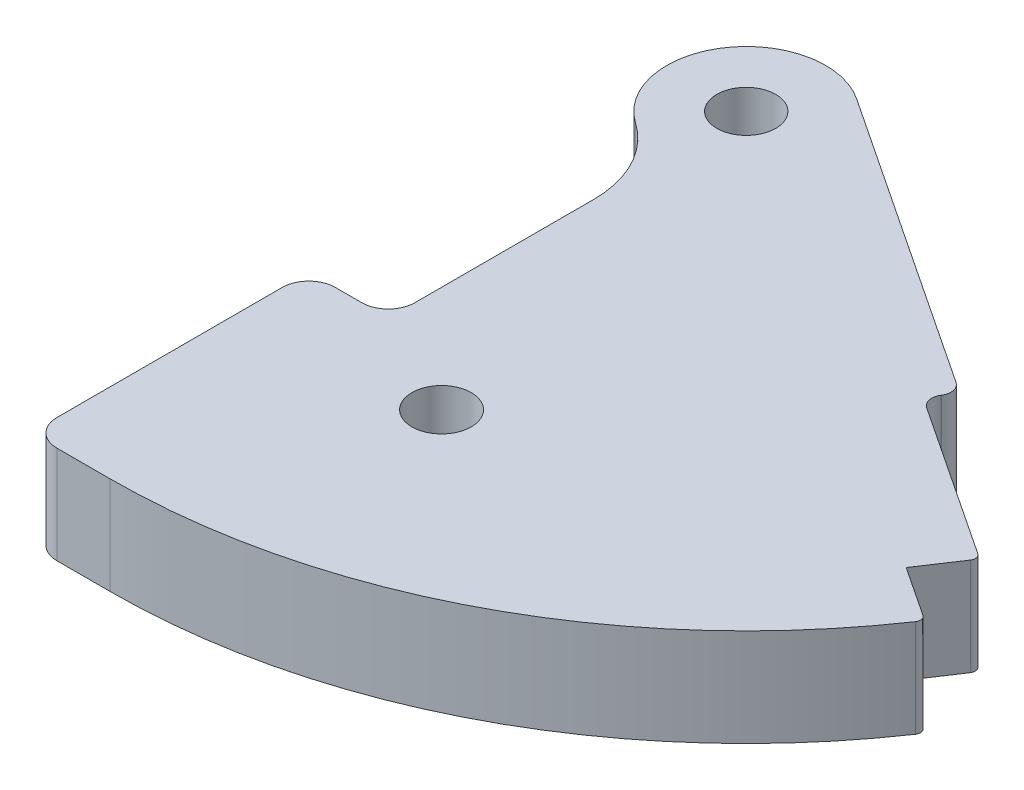
ISO-10303-21;
HEADER;
FILE_DESCRIPTION(('STEP AP214'),'2;1');
FILE_NAME('part.step','',(''),(''),'','','');
FILE_SCHEMA(('AUTOMOTIVE_DESIGN { 1 0 10303 214 1 1 1 1 }'));
ENDSEC;
DATA;
#1=APPLICATION_CONTEXT('core data for automotive mechanical design processes');
#2=APPLICATION_PROTOCOL_DEFINITION('international standard','automotive_design',2000,#1);
#3=PRODUCT_CONTEXT('',#1,'mechanical');
#4=PRODUCT('Part','Part','',(#3));
#5=PRODUCT_RELATED_PRODUCT_CATEGORY('part','',(#4));
#6=PRODUCT_DEFINITION_FORMATION('','',#4);
#7=PRODUCT_DEFINITION_CONTEXT('part definition',#1,'design');
#8=PRODUCT_DEFINITION('design','',#6,#7);
#9=PRODUCT_DEFINITION_SHAPE('','',#8);
#10=(LENGTH_UNIT() NAMED_UNIT(*) SI_UNIT(.MILLI.,.METRE.));
#11=(NAMED_UNIT(*) PLANE_ANGLE_UNIT() SI_UNIT($,.RADIAN.));
#12=(NAMED_UNIT(*) SI_UNIT($,.STERADIAN.) SOLID_ANGLE_UNIT());
#13=UNCERTAINTY_MEASURE_WITH_UNIT(LENGTH_MEASURE(1.E-05),#10,'distance_accuracy_value','');
#14=(GEOMETRIC_REPRESENTATION_CONTEXT(3) GLOBAL_UNCERTAINTY_ASSIGNED_CONTEXT((#13)) GLOBAL_UNIT_ASSIGNED_CONTEXT((#10,
#11,#12)) REPRESENTATION_CONTEXT('',''));
#15=CARTESIAN_POINT('',(0.,0.,0.));
#16=DIRECTION('',(0.,0.,1.));
#17=DIRECTION('',(1.,0.,0.));
#18=AXIS2_PLACEMENT_3D('',#15,#16,#17);
#19=CARTESIAN_POINT('',(2.6325709273446,5.842,-3.96875));
#20=DIRECTION('',(0.552770798392566,0.,-0.833333333333333));
#21=DIRECTION('',(-0.833333333333333,0.,-0.552770798392566));
#22=AXIS2_PLACEMENT_3D('',#19,#20,#21);
#23=PLANE('',#22);
#24=DIRECTION('',(0.833333333333334,0.,0.552770798392567));
#25=VECTOR('',#24,1.);
#26=CARTESIAN_POINT('',(2.6325709273446,5.842,-3.96875));
#27=LINE('',#26,#25);
#28=CARTESIAN_POINT('',(2.6325709273446,5.842,-3.96875));
#29=VERTEX_POINT('',#28);
#30=CARTESIAN_POINT('',(20.3349867986522,5.842,7.77370426559191));
#31=VERTEX_POINT('',#30);
#32=EDGE_CURVE('E180',#29,#31,#27,.T.);
#33=ORIENTED_EDGE('',*,*,#32,.T.);
#34=DIRECTION('',(0.,-1.,0.));
#35=VECTOR('',#34,1.);
#36=CARTESIAN_POINT('',(20.3349867986522,5.842,7.7737042655919));
#37=LINE('',#36,#35);
#38=CARTESIAN_POINT('',(20.3349867986522,0.,7.77370426559191));
#39=VERTEX_POINT('',#38);
#40=EDGE_CURVE('E317',#31,#39,#37,.T.);
#41=ORIENTED_EDGE('',*,*,#40,.T.);
#42=DIRECTION('',(0.833333333333334,0.,0.552770798392567));
#43=VECTOR('',#42,1.);
#44=CARTESIAN_POINT('',(2.6325709273446,0.,-3.96875));
#45=LINE('',#44,#43);
#46=CARTESIAN_POINT('',(2.6325709273446,0.,-3.96875));
#47=VERTEX_POINT('',#46);
#48=EDGE_CURVE('E187',#47,#39,#45,.T.);
#49=ORIENTED_EDGE('',*,*,#48,.F.);
#50=DIRECTION('',(0.,-1.,0.));
#51=VECTOR('',#50,1.);
#52=CARTESIAN_POINT('',(2.6325709273446,5.842,-3.96875));
#53=LINE('',#52,#51);
#54=EDGE_CURVE('E173',#29,#47,#53,.T.);
#55=ORIENTED_EDGE('',*,*,#54,.F.);
#56=EDGE_LOOP('',(#33,#41,#49,#55));
#57=FACE_BOUND('',#56,.T.);
#58=ADVANCED_FACE('F37',(#57),#23,.T.);
#59=CARTESIAN_POINT('',(0.,5.842,0.));
#60=DIRECTION('',(0.,-1.,0.));
#61=DIRECTION('',(0.,0.,-1.));
#62=AXIS2_PLACEMENT_3D('',#59,#60,#61);
#63=CYLINDRICAL_SURFACE('',#62,4.7625);
#64=CARTESIAN_POINT('',(0.,0.,0.));
#65=DIRECTION('',(0.,1.,0.));
#66=DIRECTION('',(0.,0.,1.));
#67=AXIS2_PLACEMENT_3D('',#64,#65,#66);
#68=CIRCLE('',#67,4.7625);
#69=CARTESIAN_POINT('',(-2.72142857142857,0.,3.90835422916248));
#70=VERTEX_POINT('',#69);
#71=EDGE_CURVE('E232',#70,#47,#68,.F.);
#72=ORIENTED_EDGE('',*,*,#71,.F.);
#73=DIRECTION('',(0.,-1.,0.));
#74=VECTOR('',#73,1.);
#75=CARTESIAN_POINT('',(-2.72142857142857,5.842,3.90835422916248));
#76=LINE('',#75,#74);
#77=CARTESIAN_POINT('',(-2.72142857142857,5.842,3.90835422916248));
#78=VERTEX_POINT('',#77);
#79=EDGE_CURVE('E176',#70,#78,#76,.F.);
#80=ORIENTED_EDGE('',*,*,#79,.T.);
#81=CARTESIAN_POINT('',(0.,5.842,0.));
#82=DIRECTION('',(0.,1.,0.));
#83=DIRECTION('',(0.,0.,1.));
#84=AXIS2_PLACEMENT_3D('',#81,#82,#83);
#85=CIRCLE('',#84,4.7625);
#86=EDGE_CURVE('E169',#78,#29,#85,.F.);
#87=ORIENTED_EDGE('',*,*,#86,.T.);
#88=ORIENTED_EDGE('',*,*,#54,.T.);
#89=EDGE_LOOP('',(#72,#80,#87,#88));
#90=FACE_BOUND('',#89,.T.);
#91=ADVANCED_FACE('F172',(#90),#63,.T.);
#92=CARTESIAN_POINT('',(0.,5.842,0.));
#93=DIRECTION('',(1.,0.,0.));
#94=DIRECTION('',(0.,0.,-1.));
#95=AXIS2_PLACEMENT_3D('',#92,#93,#94);
#96=PLANE('',#95);
#97=DIRECTION('',(0.,0.,1.));
#98=VECTOR('',#97,1.);
#99=CARTESIAN_POINT('',(0.,5.842,0.));
#100=LINE('',#99,#98);
#101=CARTESIAN_POINT('',(0.,5.842,9.11949320137912));
#102=VERTEX_POINT('',#101);
#103=CARTESIAN_POINT('',(0.,5.842,19.84375));
#104=VERTEX_POINT('',#103);
#105=EDGE_CURVE('E179',#102,#104,#100,.T.);
#106=ORIENTED_EDGE('',*,*,#105,.F.);
#107=DIRECTION('',(0.,-1.,0.));
#108=VECTOR('',#107,1.);
#109=CARTESIAN_POINT('',(0.,5.842,9.11949320137912));
#110=LINE('',#109,#108);
#111=CARTESIAN_POINT('',(0.,0.,9.11949320137912));
#112=VERTEX_POINT('',#111);
#113=EDGE_CURVE('E291',#102,#112,#110,.T.);
#114=ORIENTED_EDGE('',*,*,#113,.T.);
#115=DIRECTION('',(0.,0.,1.));
#116=VECTOR('',#115,1.);
#117=CARTESIAN_POINT('',(0.,0.,0.));
#118=LINE('',#117,#116);
#119=CARTESIAN_POINT('',(0.,0.,19.84375));
#120=VERTEX_POINT('',#119);
#121=EDGE_CURVE('E234',#112,#120,#118,.T.);
#122=ORIENTED_EDGE('',*,*,#121,.T.);
#123=DIRECTION('',(0.,-1.,0.));
#124=VECTOR('',#123,1.);
#125=CARTESIAN_POINT('',(0.,5.842,19.84375));
#126=LINE('',#125,#124);
#127=EDGE_CURVE('E283',#120,#104,#126,.F.);
#128=ORIENTED_EDGE('',*,*,#127,.T.);
#129=EDGE_LOOP('',(#106,#114,#122,#128));
#130=FACE_BOUND('',#129,.T.);
#131=ADVANCED_FACE('F347',(#130),#96,.F.);
#132=CARTESIAN_POINT('',(0.,5.842,21.43125));
#133=DIRECTION('',(0.,0.,1.));
#134=DIRECTION('',(1.,0.,0.));
#135=AXIS2_PLACEMENT_3D('',#132,#133,#134);
#136=PLANE('',#135);
#137=DIRECTION('',(-1.,0.,0.));
#138=VECTOR('',#137,1.);
#139=CARTESIAN_POINT('',(0.,0.,21.43125));
#140=LINE('',#139,#138);
#141=CARTESIAN_POINT('',(-1.5875,0.,21.43125));
#142=VERTEX_POINT('',#141);
#143=CARTESIAN_POINT('',(-3.175,0.,21.43125));
#144=VERTEX_POINT('',#143);
#145=EDGE_CURVE('E236',#142,#144,#140,.T.);
#146=ORIENTED_EDGE('',*,*,#145,.T.);
#147=DIRECTION('',(0.,-1.,0.));
#148=VECTOR('',#147,1.);
#149=CARTESIAN_POINT('',(-3.175,5.842,21.43125));
#150=LINE('',#149,#148);
#151=CARTESIAN_POINT('',(-3.175,5.842,21.43125));
#152=VERTEX_POINT('',#151);
#153=EDGE_CURVE('E281',#144,#152,#150,.F.);
#154=ORIENTED_EDGE('',*,*,#153,.T.);
#155=DIRECTION('',(-1.,0.,0.));
#156=VECTOR('',#155,1.);
#157=CARTESIAN_POINT('',(0.,5.842,21.43125));
#158=LINE('',#157,#156);
#159=CARTESIAN_POINT('',(-1.5875,5.842,21.43125));
#160=VERTEX_POINT('',#159);
#161=EDGE_CURVE('E202',#160,#152,#158,.T.);
#162=ORIENTED_EDGE('',*,*,#161,.F.);
#163=DIRECTION('',(0.,-1.,0.));
#164=VECTOR('',#163,1.);
#165=CARTESIAN_POINT('',(-1.5875,0.,21.43125));
#166=LINE('',#165,#164);
#167=EDGE_CURVE('E278',#160,#142,#166,.T.);
#168=ORIENTED_EDGE('',*,*,#167,.T.);
#169=EDGE_LOOP('',(#146,#154,#162,#168));
#170=FACE_BOUND('',#169,.T.);
#171=ADVANCED_FACE('F356',(#170),#136,.F.);
#172=CARTESIAN_POINT('',(-4.7625,5.842,0.));
#173=DIRECTION('',(1.,0.,0.));
#174=DIRECTION('',(0.,0.,-1.));
#175=AXIS2_PLACEMENT_3D('',#172,#173,#174);
#176=PLANE('',#175);
#177=DIRECTION('',(0.,0.,1.));
#178=VECTOR('',#177,1.);
#179=CARTESIAN_POINT('',(-4.7625,0.,0.));
#180=LINE('',#179,#178);
#181=CARTESIAN_POINT('',(-4.7625,0.,23.01875));
#182=VERTEX_POINT('',#181);
#183=CARTESIAN_POINT('',(-4.7625,0.,36.5125));
#184=VERTEX_POINT('',#183);
#185=EDGE_CURVE('E239',#182,#184,#180,.T.);
#186=ORIENTED_EDGE('',*,*,#185,.T.);
#187=DIRECTION('',(0.,-1.,0.));
#188=VECTOR('',#187,1.);
#189=CARTESIAN_POINT('',(-4.7625,5.842,36.5125));
#190=LINE('',#189,#188);
#191=CARTESIAN_POINT('',(-4.7625,5.842,36.5125));
#192=VERTEX_POINT('',#191);
#193=EDGE_CURVE('E272',#184,#192,#190,.F.);
#194=ORIENTED_EDGE('',*,*,#193,.T.);
#195=DIRECTION('',(0.,0.,1.));
#196=VECTOR('',#195,1.);
#197=CARTESIAN_POINT('',(-4.7625,5.842,0.));
#198=LINE('',#197,#196);
#199=CARTESIAN_POINT('',(-4.7625,5.842,23.01875));
#200=VERTEX_POINT('',#199);
#201=EDGE_CURVE('E205',#200,#192,#198,.T.);
#202=ORIENTED_EDGE('',*,*,#201,.F.);
#203=DIRECTION('',(0.,-1.,0.));
#204=VECTOR('',#203,1.);
#205=CARTESIAN_POINT('',(-4.7625,5.842,23.01875));
#206=LINE('',#205,#204);
#207=EDGE_CURVE('E269',#200,#182,#206,.T.);
#208=ORIENTED_EDGE('',*,*,#207,.T.);
#209=EDGE_LOOP('',(#186,#194,#202,#208));
#210=FACE_BOUND('',#209,.T.);
#211=ADVANCED_FACE('F365',(#210),#176,.F.);
#212=CARTESIAN_POINT('',(0.,5.842,38.1));
#213=DIRECTION('',(0.,0.,1.));
#214=DIRECTION('',(1.,0.,0.));
#215=AXIS2_PLACEMENT_3D('',#212,#213,#214);
#216=PLANE('',#215);
#217=DIRECTION('',(-1.,0.,0.));
#218=VECTOR('',#217,1.);
#219=CARTESIAN_POINT('',(0.,5.842,38.1));
#220=LINE('',#219,#218);
#221=CARTESIAN_POINT('',(0.,5.842,38.1));
#222=VERTEX_POINT('',#221);
#223=CARTESIAN_POINT('',(-3.175,5.842,38.1));
#224=VERTEX_POINT('',#223);
#225=EDGE_CURVE('E208',#222,#224,#220,.T.);
#226=ORIENTED_EDGE('',*,*,#225,.T.);
#227=DIRECTION('',(0.,-1.,0.));
#228=VECTOR('',#227,1.);
#229=CARTESIAN_POINT('',(-3.175,0.,38.1));
#230=LINE('',#229,#228);
#231=CARTESIAN_POINT('',(-3.175,0.,38.1));
#232=VERTEX_POINT('',#231);
#233=EDGE_CURVE('E188',#224,#232,#230,.T.);
#234=ORIENTED_EDGE('',*,*,#233,.T.);
#235=DIRECTION('',(-1.,0.,0.));
#236=VECTOR('',#235,1.);
#237=CARTESIAN_POINT('',(0.,0.,38.1));
#238=LINE('',#237,#236);
#239=CARTESIAN_POINT('',(0.,0.,38.1));
#240=VERTEX_POINT('',#239);
#241=EDGE_CURVE('E242',#240,#232,#238,.T.);
#242=ORIENTED_EDGE('',*,*,#241,.F.);
#243=DIRECTION('',(0.,-1.,0.));
#244=VECTOR('',#243,1.);
#245=CARTESIAN_POINT('',(0.,5.842,38.1));
#246=LINE('',#245,#244);
#247=EDGE_CURVE('E189',#222,#240,#246,.T.);
#248=ORIENTED_EDGE('',*,*,#247,.F.);
#249=EDGE_LOOP('',(#226,#234,#242,#248));
#250=FACE_BOUND('',#249,.T.);
#251=ADVANCED_FACE('F373',(#250),#216,.T.);
#252=CARTESIAN_POINT('',(0.,5.842,0.));
#253=DIRECTION('',(0.,-1.,0.));
#254=DIRECTION('',(0.,0.,-1.));
#255=AXIS2_PLACEMENT_3D('',#252,#253,#254);
#256=CYLINDRICAL_SURFACE('',#255,38.1);
#257=CARTESIAN_POINT('',(0.,0.,0.));
#258=DIRECTION('',(0.,1.,0.));
#259=DIRECTION('',(0.,0.,1.));
#260=AXIS2_PLACEMENT_3D('',#257,#258,#259);
#261=CIRCLE('',#260,38.1);
#262=CARTESIAN_POINT('',(31.526550765146,0.,21.393611122311));
#263=VERTEX_POINT('',#262);
#264=EDGE_CURVE('E245',#240,#263,#261,.T.);
#265=ORIENTED_EDGE('',*,*,#264,.T.);
#266=DIRECTION('',(0.,-1.,0.));
#267=VECTOR('',#266,1.);
#268=CARTESIAN_POINT('',(31.5265507651461,5.842,21.393611122311));
#269=LINE('',#268,#267);
#270=CARTESIAN_POINT('',(31.526550765146,5.842,21.393611122311));
#271=VERTEX_POINT('',#270);
#272=EDGE_CURVE('E306',#263,#271,#269,.F.);
#273=ORIENTED_EDGE('',*,*,#272,.T.);
#274=CARTESIAN_POINT('',(0.,5.842,0.));
#275=DIRECTION('',(0.,1.,0.));
#276=DIRECTION('',(0.,0.,1.));
#277=AXIS2_PLACEMENT_3D('',#274,#275,#276);
#278=CIRCLE('',#277,38.1);
#279=EDGE_CURVE('E211',#222,#271,#278,.T.);
#280=ORIENTED_EDGE('',*,*,#279,.F.);
#281=ORIENTED_EDGE('',*,*,#247,.T.);
#282=EDGE_LOOP('',(#265,#273,#280,#281));
#283=FACE_BOUND('',#282,.T.);
#284=ADVANCED_FACE('F378',(#283),#256,.T.);
#285=CARTESIAN_POINT('',(0.,5.842,0.));
#286=DIRECTION('',(0.552770798392565,0.,-0.833333333333334));
#287=DIRECTION('',(-0.833333333333334,0.,-0.552770798392565));
#288=AXIS2_PLACEMENT_3D('',#285,#286,#287);
#289=PLANE('',#288);
#290=DIRECTION('',(0.833333333333334,0.,0.552770798392565));
#291=VECTOR('',#290,1.);
#292=CARTESIAN_POINT('',(0.,5.842,0.));
#293=LINE('',#292,#291);
#294=CARTESIAN_POINT('',(28.4427083333333,5.842,18.8667583126363));
#295=VERTEX_POINT('',#294);
#296=CARTESIAN_POINT('',(31.4175301052878,5.842,20.8400318397869));
#297=VERTEX_POINT('',#296);
#298=EDGE_CURVE('E214',#295,#297,#293,.T.);
#299=ORIENTED_EDGE('',*,*,#298,.T.);
#300=DIRECTION('',(0.,1.,0.));
#301=VECTOR('',#300,1.);
#302=CARTESIAN_POINT('',(31.4175301052878,0.,20.8400318397869));
#303=LINE('',#302,#301);
#304=CARTESIAN_POINT('',(31.4175301052878,0.,20.8400318397869));
#305=VERTEX_POINT('',#304);
#306=EDGE_CURVE('E299',#297,#305,#303,.F.);
#307=ORIENTED_EDGE('',*,*,#306,.T.);
#308=DIRECTION('',(0.833333333333334,0.,0.552770798392565));
#309=VECTOR('',#308,1.);
#310=CARTESIAN_POINT('',(0.,0.,0.));
#311=LINE('',#310,#309);
#312=CARTESIAN_POINT('',(28.4427083333333,0.,18.8667583126363));
#313=VERTEX_POINT('',#312);
#314=EDGE_CURVE('E248',#313,#305,#311,.T.);
#315=ORIENTED_EDGE('',*,*,#314,.F.);
#316=DIRECTION('',(0.,-1.,0.));
#317=VECTOR('',#316,1.);
#318=CARTESIAN_POINT('',(28.4427083333333,5.842,18.8667583126363));
#319=LINE('',#318,#317);
#320=EDGE_CURVE('E227',#295,#313,#319,.T.);
#321=ORIENTED_EDGE('',*,*,#320,.F.);
#322=EDGE_LOOP('',(#299,#307,#315,#321));
#323=FACE_BOUND('',#322,.T.);
#324=ADVANCED_FACE('F387',(#323),#289,.T.);
#325=CARTESIAN_POINT('',(28.4427083333333,5.842,18.8667583126363));
#326=DIRECTION('',(-0.833333333333333,0.,-0.552770798392567));
#327=DIRECTION('',(-0.552770798392567,0.,0.833333333333333));
#328=AXIS2_PLACEMENT_3D('',#325,#326,#327);
#329=PLANE('',#328);
#330=DIRECTION('',(0.552770798392567,0.,-0.833333333333333));
#331=VECTOR('',#330,1.);
#332=CARTESIAN_POINT('',(28.4427083333333,0.,18.8667583126363));
#333=LINE('',#332,#331);
#334=CARTESIAN_POINT('',(29.9783747076177,0.,16.5516541459696));
#335=VERTEX_POINT('',#334);
#336=EDGE_CURVE('E251',#313,#335,#333,.T.);
#337=ORIENTED_EDGE('',*,*,#336,.T.);
#338=DIRECTION('',(0.,-1.,0.));
#339=VECTOR('',#338,1.);
#340=CARTESIAN_POINT('',(29.9783747076177,5.842,16.5516541459696));
#341=LINE('',#340,#339);
#342=CARTESIAN_POINT('',(29.9783747076177,5.842,16.5516541459696));
#343=VERTEX_POINT('',#342);
#344=EDGE_CURVE('E315',#335,#343,#341,.F.);
#345=ORIENTED_EDGE('',*,*,#344,.T.);
#346=DIRECTION('',(0.552770798392567,0.,-0.833333333333333));
#347=VECTOR('',#346,1.);
#348=CARTESIAN_POINT('',(28.4427083333333,5.842,18.8667583126363));
#349=LINE('',#348,#347);
#350=EDGE_CURVE('E217',#295,#343,#349,.T.);
#351=ORIENTED_EDGE('',*,*,#350,.F.);
#352=ORIENTED_EDGE('',*,*,#320,.T.);
#353=EDGE_LOOP('',(#337,#345,#351,#352));
#354=FACE_BOUND('',#353,.T.);
#355=ADVANCED_FACE('F391',(#354),#329,.F.);
#356=CARTESIAN_POINT('',(1.75504728489641,5.842,-2.64583333333335));
#357=DIRECTION('',(-0.552770798392567,0.,0.833333333333333));
#358=DIRECTION('',(0.833333333333333,0.,0.552770798392567));
#359=AXIS2_PLACEMENT_3D('',#356,#357,#358);
#360=PLANE('',#359);
#361=DIRECTION('',(-0.833333333333333,0.,-0.552770798392567));
#362=VECTOR('',#361,1.);
#363=CARTESIAN_POINT('',(1.75504728489641,0.,-2.64583333333335));
#364=LINE('',#363,#362);
#365=CARTESIAN_POINT('',(29.8670264515631,0.,16.0015440686909));
#366=VERTEX_POINT('',#365);
#367=CARTESIAN_POINT('',(20.7805937267347,0.,9.97428646247842));
#368=VERTEX_POINT('',#367);
#369=EDGE_CURVE('E254',#366,#368,#364,.T.);
#370=ORIENTED_EDGE('',*,*,#369,.T.);
#371=DIRECTION('',(0.,-1.,0.));
#372=VECTOR('',#371,1.);
#373=CARTESIAN_POINT('',(20.7805937267347,5.842,9.97428646247842));
#374=LINE('',#373,#372);
#375=CARTESIAN_POINT('',(20.7805937267347,5.842,9.97428646247842));
#376=VERTEX_POINT('',#375);
#377=EDGE_CURVE('E52',#368,#376,#374,.F.);
#378=ORIENTED_EDGE('',*,*,#377,.T.);
#379=DIRECTION('',(-0.833333333333333,0.,-0.552770798392567));
#380=VECTOR('',#379,1.);
#381=CARTESIAN_POINT('',(1.75504728489641,5.842,-2.64583333333335));
#382=LINE('',#381,#380);
#383=CARTESIAN_POINT('',(29.8670264515631,5.842,16.0015440686909));
#384=VERTEX_POINT('',#383);
#385=EDGE_CURVE('E220',#384,#376,#382,.T.);
#386=ORIENTED_EDGE('',*,*,#385,.F.);
#387=DIRECTION('',(0.,-1.,0.));
#388=VECTOR('',#387,1.);
#389=CARTESIAN_POINT('',(29.8670264515631,5.842,16.0015440686909));
#390=LINE('',#389,#388);
#391=EDGE_CURVE('E312',#384,#366,#390,.T.);
#392=ORIENTED_EDGE('',*,*,#391,.T.);
#393=EDGE_LOOP('',(#370,#378,#386,#392));
#394=FACE_BOUND('',#393,.T.);
#395=ADVANCED_FACE('F334',(#394),#360,.F.);
#396=CARTESIAN_POINT('',(18.6372029811088,5.842,11.8855763007916));
#397=DIRECTION('',(0.843137791243833,0.,0.537697559020376));
#398=DIRECTION('',(0.537697559020376,0.,-0.843137791243833));
#399=AXIS2_PLACEMENT_3D('',#396,#397,#398);
#400=PLANE('',#399);
#401=DIRECTION('',(-0.537697559020376,0.,0.843137791243833));
#402=VECTOR('',#401,1.);
#403=CARTESIAN_POINT('',(18.6372029811088,0.,11.8855763007916));
#404=LINE('',#403,#402);
#405=CARTESIAN_POINT('',(20.5654655992279,0.,8.86196003639766));
#406=VERTEX_POINT('',#405);
#407=CARTESIAN_POINT('',(20.550114926159,0.,8.88603069167266));
#408=VERTEX_POINT('',#407);
#409=EDGE_CURVE('E256',#406,#408,#404,.T.);
#410=ORIENTED_EDGE('',*,*,#409,.F.);
#411=DIRECTION('',(0.,-1.,0.));
#412=VECTOR('',#411,1.);
#413=CARTESIAN_POINT('',(20.5654655992279,5.842,8.86196003639766));
#414=LINE('',#413,#412);
#415=CARTESIAN_POINT('',(20.5654655992279,5.842,8.86196003639766));
#416=VERTEX_POINT('',#415);
#417=EDGE_CURVE('E324',#406,#416,#414,.F.);
#418=ORIENTED_EDGE('',*,*,#417,.T.);
#419=DIRECTION('',(-0.537697559020376,0.,0.843137791243833));
#420=VECTOR('',#419,1.);
#421=CARTESIAN_POINT('',(18.6372029811088,5.842,11.8855763007916));
#422=LINE('',#421,#420);
#423=CARTESIAN_POINT('',(20.550114926159,5.842,8.88603069167266));
#424=VERTEX_POINT('',#423);
#425=EDGE_CURVE('E222',#416,#424,#422,.T.);
#426=ORIENTED_EDGE('',*,*,#425,.T.);
#427=DIRECTION('',(0.,-1.,0.));
#428=VECTOR('',#427,1.);
#429=CARTESIAN_POINT('',(20.550114926159,5.842,8.88603069167266));
#430=LINE('',#429,#428);
#431=EDGE_CURVE('E321',#424,#408,#430,.T.);
#432=ORIENTED_EDGE('',*,*,#431,.T.);
#433=EDGE_LOOP('',(#410,#418,#426,#432));
#434=FACE_BOUND('',#433,.T.);
#435=ADVANCED_FACE('F337',(#434),#400,.T.);
#436=CARTESIAN_POINT('',(6.35,5.842,24.5934442484171));
#437=DIRECTION('',(0.,-1.,0.));
#438=DIRECTION('',(0.,0.,-1.));
#439=AXIS2_PLACEMENT_3D('',#436,#437,#438);
#440=CYLINDRICAL_SURFACE('',#439,1.778);
#441=CARTESIAN_POINT('',(6.35,5.842,24.5934442484171));
#442=DIRECTION('',(0.,1.,0.));
#443=DIRECTION('',(0.,0.,1.));
#444=AXIS2_PLACEMENT_3D('',#441,#442,#443);
#445=CIRCLE('',#444,1.778);
#446=CARTESIAN_POINT('',(6.35,5.842,26.3714442484171));
#447=VERTEX_POINT('',#446);
#448=EDGE_CURVE('E195',#447,#447,#445,.T.);
#449=ORIENTED_EDGE('',*,*,#448,.T.);
#450=EDGE_LOOP('',(#449));
#451=FACE_BOUND('',#450,.T.);
#452=CARTESIAN_POINT('',(6.35,0.,24.5934442484171));
#453=DIRECTION('',(0.,1.,0.));
#454=DIRECTION('',(0.,0.,1.));
#455=AXIS2_PLACEMENT_3D('',#452,#453,#454);
#456=CIRCLE('',#455,1.778);
#457=CARTESIAN_POINT('',(6.35,0.,26.3714442484171));
#458=VERTEX_POINT('',#457);
#459=EDGE_CURVE('E228',#458,#458,#456,.T.);
#460=ORIENTED_EDGE('',*,*,#459,.F.);
#461=EDGE_LOOP('',(#460));
#462=FACE_BOUND('',#461,.T.);
#463=ADVANCED_FACE('F411',(#451,#462),#440,.F.);
#464=CARTESIAN_POINT('',(0.,5.842,0.));
#465=DIRECTION('',(0.,-1.,0.));
#466=DIRECTION('',(0.,0.,-1.));
#467=AXIS2_PLACEMENT_3D('',#464,#465,#466);
#468=CYLINDRICAL_SURFACE('',#467,1.7653);
#469=CARTESIAN_POINT('',(0.,5.842,0.));
#470=DIRECTION('',(0.,1.,0.));
#471=DIRECTION('',(0.,0.,1.));
#472=AXIS2_PLACEMENT_3D('',#469,#470,#471);
#473=CIRCLE('',#472,1.7653);
#474=CARTESIAN_POINT('',(0.,5.842,1.7653));
#475=VERTEX_POINT('',#474);
#476=EDGE_CURVE('E224',#475,#475,#473,.T.);
#477=ORIENTED_EDGE('',*,*,#476,.T.);
#478=EDGE_LOOP('',(#477));
#479=FACE_BOUND('',#478,.T.);
#480=CARTESIAN_POINT('',(0.,0.,0.));
#481=DIRECTION('',(0.,1.,0.));
#482=DIRECTION('',(0.,0.,1.));
#483=AXIS2_PLACEMENT_3D('',#480,#481,#482);
#484=CIRCLE('',#483,1.7653);
#485=CARTESIAN_POINT('',(0.,0.,1.7653));
#486=VERTEX_POINT('',#485);
#487=EDGE_CURVE('E198',#486,#486,#484,.T.);
#488=ORIENTED_EDGE('',*,*,#487,.F.);
#489=EDGE_LOOP('',(#488));
#490=FACE_BOUND('',#489,.T.);
#491=ADVANCED_FACE('F414',(#479,#490),#468,.F.);
#492=CARTESIAN_POINT('',(0.,5.842,0.));
#493=DIRECTION('',(0.,1.,0.));
#494=DIRECTION('',(0.,0.,1.));
#495=AXIS2_PLACEMENT_3D('',#492,#493,#494);
#496=PLANE('',#495);
#497=ORIENTED_EDGE('',*,*,#448,.F.);
#498=EDGE_LOOP('',(#497));
#499=FACE_BOUND('',#498,.T.);
#500=ORIENTED_EDGE('',*,*,#425,.F.);
#501=CARTESIAN_POINT('',(19.8962249774281,5.842,8.43516259892523));
#502=DIRECTION('',(0.,1.,0.));
#503=DIRECTION('',(0.,0.,1.));
#504=AXIS2_PLACEMENT_3D('',#501,#502,#503);
#505=CIRCLE('',#504,0.79375);
#506=EDGE_CURVE('E194',#416,#31,#505,.T.);
#507=ORIENTED_EDGE('',*,*,#506,.T.);
#508=ORIENTED_EDGE('',*,*,#32,.F.);
#509=ORIENTED_EDGE('',*,*,#86,.F.);
#510=CARTESIAN_POINT('',(-6.35,5.842,9.11949320137912));
#511=DIRECTION('',(0.,1.,0.));
#512=DIRECTION('',(0.,0.,1.));
#513=AXIS2_PLACEMENT_3D('',#510,#511,#512);
#514=CIRCLE('',#513,6.35);
#515=EDGE_CURVE('E297',#78,#102,#514,.F.);
#516=ORIENTED_EDGE('',*,*,#515,.T.);
#517=ORIENTED_EDGE('',*,*,#105,.T.);
#518=CARTESIAN_POINT('',(-1.5875,5.842,19.84375));
#519=DIRECTION('',(0.,1.,0.));
#520=DIRECTION('',(0.,0.,1.));
#521=AXIS2_PLACEMENT_3D('',#518,#519,#520);
#522=CIRCLE('',#521,1.5875);
#523=EDGE_CURVE('E289',#104,#160,#522,.F.);
#524=ORIENTED_EDGE('',*,*,#523,.T.);
#525=ORIENTED_EDGE('',*,*,#161,.T.);
#526=CARTESIAN_POINT('',(-3.175,5.842,23.01875));
#527=DIRECTION('',(0.,1.,0.));
#528=DIRECTION('',(0.,0.,1.));
#529=AXIS2_PLACEMENT_3D('',#526,#527,#528);
#530=CIRCLE('',#529,1.5875);
#531=EDGE_CURVE('E274',#152,#200,#530,.T.);
#532=ORIENTED_EDGE('',*,*,#531,.T.);
#533=ORIENTED_EDGE('',*,*,#201,.T.);
#534=CARTESIAN_POINT('',(-3.175,5.842,36.5125));
#535=DIRECTION('',(0.,1.,0.));
#536=DIRECTION('',(0.,0.,1.));
#537=AXIS2_PLACEMENT_3D('',#534,#535,#536);
#538=CIRCLE('',#537,1.5875);
#539=EDGE_CURVE('E276',#192,#224,#538,.T.);
#540=ORIENTED_EDGE('',*,*,#539,.T.);
#541=ORIENTED_EDGE('',*,*,#225,.F.);
#542=ORIENTED_EDGE('',*,*,#279,.T.);
#543=CARTESIAN_POINT('',(31.1981491946758,5.842,21.1707610064536));
#544=DIRECTION('',(0.,1.,0.));
#545=DIRECTION('',(0.,0.,1.));
#546=AXIS2_PLACEMENT_3D('',#543,#544,#545);
#547=CIRCLE('',#546,0.396875);
#548=EDGE_CURVE('E310',#271,#297,#547,.T.);
#549=ORIENTED_EDGE('',*,*,#548,.T.);
#550=ORIENTED_EDGE('',*,*,#298,.F.);
#551=ORIENTED_EDGE('',*,*,#350,.T.);
#552=CARTESIAN_POINT('',(29.647645540951,5.842,16.3322732353576));
#553=DIRECTION('',(0.,1.,0.));
#554=DIRECTION('',(0.,0.,1.));
#555=AXIS2_PLACEMENT_3D('',#552,#553,#554);
#556=CIRCLE('',#555,0.396875);
#557=EDGE_CURVE('E308',#343,#384,#556,.T.);
#558=ORIENTED_EDGE('',*,*,#557,.T.);
#559=ORIENTED_EDGE('',*,*,#385,.T.);
#560=CARTESIAN_POINT('',(21.2193555479588,5.842,9.31282812914509));
#561=DIRECTION('',(0.,1.,0.));
#562=DIRECTION('',(0.,0.,1.));
#563=AXIS2_PLACEMENT_3D('',#560,#561,#562);
#564=CIRCLE('',#563,0.79375);
#565=EDGE_CURVE('E11',#376,#424,#564,.F.);
#566=ORIENTED_EDGE('',*,*,#565,.T.);
#567=EDGE_LOOP('',(#500,#507,#508,#509,#516,#517,#524,#525,#532,#533,#540,#541,#542,#549,#550,
#551,#558,#559,#566));
#568=FACE_BOUND('',#567,.T.);
#569=ORIENTED_EDGE('',*,*,#476,.F.);
#570=EDGE_LOOP('',(#569));
#571=FACE_BOUND('',#570,.T.);
#572=ADVANCED_FACE('F191',(#499,#568,#571),#496,.T.);
#573=CARTESIAN_POINT('',(0.,0.,0.));
#574=DIRECTION('',(0.,1.,0.));
#575=DIRECTION('',(0.,0.,1.));
#576=AXIS2_PLACEMENT_3D('',#573,#574,#575);
#577=PLANE('',#576);
#578=ORIENTED_EDGE('',*,*,#459,.T.);
#579=EDGE_LOOP('',(#578));
#580=FACE_BOUND('',#579,.T.);
#581=ORIENTED_EDGE('',*,*,#48,.T.);
#582=CARTESIAN_POINT('',(19.8962249774281,0.,8.43516259892523));
#583=DIRECTION('',(0.,1.,0.));
#584=DIRECTION('',(0.,0.,1.));
#585=AXIS2_PLACEMENT_3D('',#582,#583,#584);
#586=CIRCLE('',#585,0.79375);
#587=EDGE_CURVE('E319',#39,#406,#586,.F.);
#588=ORIENTED_EDGE('',*,*,#587,.T.);
#589=ORIENTED_EDGE('',*,*,#409,.T.);
#590=CARTESIAN_POINT('',(21.2193555479588,0.,9.31282812914509));
#591=DIRECTION('',(0.,1.,0.));
#592=DIRECTION('',(0.,0.,1.));
#593=AXIS2_PLACEMENT_3D('',#590,#591,#592);
#594=CIRCLE('',#593,0.79375);
#595=EDGE_CURVE('E45',#408,#368,#594,.T.);
#596=ORIENTED_EDGE('',*,*,#595,.T.);
#597=ORIENTED_EDGE('',*,*,#369,.F.);
#598=CARTESIAN_POINT('',(29.647645540951,0.,16.3322732353576));
#599=DIRECTION('',(0.,1.,0.));
#600=DIRECTION('',(0.,0.,1.));
#601=AXIS2_PLACEMENT_3D('',#598,#599,#600);
#602=CIRCLE('',#601,0.396875);
#603=EDGE_CURVE('E302',#366,#335,#602,.F.);
#604=ORIENTED_EDGE('',*,*,#603,.T.);
#605=ORIENTED_EDGE('',*,*,#336,.F.);
#606=ORIENTED_EDGE('',*,*,#314,.T.);
#607=CARTESIAN_POINT('',(31.1981491946758,0.,21.1707610064536));
#608=DIRECTION('',(0.,1.,0.));
#609=DIRECTION('',(0.,0.,1.));
#610=AXIS2_PLACEMENT_3D('',#607,#608,#609);
#611=CIRCLE('',#610,0.396875);
#612=EDGE_CURVE('E304',#305,#263,#611,.F.);
#613=ORIENTED_EDGE('',*,*,#612,.T.);
#614=ORIENTED_EDGE('',*,*,#264,.F.);
#615=ORIENTED_EDGE('',*,*,#241,.T.);
#616=CARTESIAN_POINT('',(-3.175,0.,36.5125));
#617=DIRECTION('',(0.,1.,0.));
#618=DIRECTION('',(0.,0.,1.));
#619=AXIS2_PLACEMENT_3D('',#616,#617,#618);
#620=CIRCLE('',#619,1.5875);
#621=EDGE_CURVE('E267',#232,#184,#620,.F.);
#622=ORIENTED_EDGE('',*,*,#621,.T.);
#623=ORIENTED_EDGE('',*,*,#185,.F.);
#624=CARTESIAN_POINT('',(-3.175,0.,23.01875));
#625=DIRECTION('',(0.,1.,0.));
#626=DIRECTION('',(0.,0.,1.));
#627=AXIS2_PLACEMENT_3D('',#624,#625,#626);
#628=CIRCLE('',#627,1.5875);
#629=EDGE_CURVE('E265',#182,#144,#628,.F.);
#630=ORIENTED_EDGE('',*,*,#629,.T.);
#631=ORIENTED_EDGE('',*,*,#145,.F.);
#632=CARTESIAN_POINT('',(-1.5875,0.,19.84375));
#633=DIRECTION('',(0.,1.,0.));
#634=DIRECTION('',(0.,0.,1.));
#635=AXIS2_PLACEMENT_3D('',#632,#633,#634);
#636=CIRCLE('',#635,1.5875);
#637=EDGE_CURVE('E286',#142,#120,#636,.T.);
#638=ORIENTED_EDGE('',*,*,#637,.T.);
#639=ORIENTED_EDGE('',*,*,#121,.F.);
#640=CARTESIAN_POINT('',(-6.35,0.,9.11949320137912));
#641=DIRECTION('',(0.,1.,0.));
#642=DIRECTION('',(0.,0.,1.));
#643=AXIS2_PLACEMENT_3D('',#640,#641,#642);
#644=CIRCLE('',#643,6.35);
#645=EDGE_CURVE('E295',#112,#70,#644,.T.);
#646=ORIENTED_EDGE('',*,*,#645,.T.);
#647=ORIENTED_EDGE('',*,*,#71,.T.);
#648=EDGE_LOOP('',(#581,#588,#589,#596,#597,#604,#605,#606,#613,#614,#615,#622,#623,#630,#631,
#638,#639,#646,#647));
#649=FACE_BOUND('',#648,.T.);
#650=ORIENTED_EDGE('',*,*,#487,.T.);
#651=EDGE_LOOP('',(#650));
#652=FACE_BOUND('',#651,.T.);
#653=ADVANCED_FACE('F329',(#580,#649,#652),#577,.F.);
#654=CARTESIAN_POINT('',(-3.175,5.842,36.5125));
#655=DIRECTION('',(0.,1.,0.));
#656=DIRECTION('',(0.,0.,1.));
#657=AXIS2_PLACEMENT_3D('',#654,#655,#656);
#658=CYLINDRICAL_SURFACE('',#657,1.5875);
#659=ORIENTED_EDGE('',*,*,#539,.F.);
#660=ORIENTED_EDGE('',*,*,#193,.F.);
#661=ORIENTED_EDGE('',*,*,#621,.F.);
#662=ORIENTED_EDGE('',*,*,#233,.F.);
#663=EDGE_LOOP('',(#659,#660,#661,#662));
#664=FACE_BOUND('',#663,.T.);
#665=ADVANCED_FACE('F369',(#664),#658,.T.);
#666=CARTESIAN_POINT('',(-3.175,5.842,23.01875));
#667=DIRECTION('',(0.,-1.,0.));
#668=DIRECTION('',(0.,0.,-1.));
#669=AXIS2_PLACEMENT_3D('',#666,#667,#668);
#670=CYLINDRICAL_SURFACE('',#669,1.5875);
#671=ORIENTED_EDGE('',*,*,#531,.F.);
#672=ORIENTED_EDGE('',*,*,#153,.F.);
#673=ORIENTED_EDGE('',*,*,#629,.F.);
#674=ORIENTED_EDGE('',*,*,#207,.F.);
#675=EDGE_LOOP('',(#671,#672,#673,#674));
#676=FACE_BOUND('',#675,.T.);
#677=ADVANCED_FACE('F360',(#676),#670,.T.);
#678=CARTESIAN_POINT('',(-1.5875,5.842,19.84375));
#679=DIRECTION('',(0.,1.,0.));
#680=DIRECTION('',(0.,0.,1.));
#681=AXIS2_PLACEMENT_3D('',#678,#679,#680);
#682=CYLINDRICAL_SURFACE('',#681,1.5875);
#683=ORIENTED_EDGE('',*,*,#523,.F.);
#684=ORIENTED_EDGE('',*,*,#127,.F.);
#685=ORIENTED_EDGE('',*,*,#637,.F.);
#686=ORIENTED_EDGE('',*,*,#167,.F.);
#687=EDGE_LOOP('',(#683,#684,#685,#686));
#688=FACE_BOUND('',#687,.T.);
#689=ADVANCED_FACE('F352',(#688),#682,.F.);
#690=CARTESIAN_POINT('',(-6.35,5.842,9.11949320137912));
#691=DIRECTION('',(0.,-1.,0.));
#692=DIRECTION('',(0.,0.,-1.));
#693=AXIS2_PLACEMENT_3D('',#690,#691,#692);
#694=CYLINDRICAL_SURFACE('',#693,6.35);
#695=ORIENTED_EDGE('',*,*,#515,.F.);
#696=ORIENTED_EDGE('',*,*,#79,.F.);
#697=ORIENTED_EDGE('',*,*,#645,.F.);
#698=ORIENTED_EDGE('',*,*,#113,.F.);
#699=EDGE_LOOP('',(#695,#696,#697,#698));
#700=FACE_BOUND('',#699,.T.);
#701=ADVANCED_FACE('F343',(#700),#694,.F.);
#702=CARTESIAN_POINT('',(31.1981491946758,5.842,21.1707610064536));
#703=DIRECTION('',(0.,-1.,0.));
#704=DIRECTION('',(0.,0.,-1.));
#705=AXIS2_PLACEMENT_3D('',#702,#703,#704);
#706=CYLINDRICAL_SURFACE('',#705,0.396875);
#707=ORIENTED_EDGE('',*,*,#548,.F.);
#708=ORIENTED_EDGE('',*,*,#272,.F.);
#709=ORIENTED_EDGE('',*,*,#612,.F.);
#710=ORIENTED_EDGE('',*,*,#306,.F.);
#711=EDGE_LOOP('',(#707,#708,#709,#710));
#712=FACE_BOUND('',#711,.T.);
#713=ADVANCED_FACE('F384',(#712),#706,.T.);
#714=CARTESIAN_POINT('',(29.647645540951,5.842,16.3322732353576));
#715=DIRECTION('',(0.,-1.,0.));
#716=DIRECTION('',(0.,0.,-1.));
#717=AXIS2_PLACEMENT_3D('',#714,#715,#716);
#718=CYLINDRICAL_SURFACE('',#717,0.396875);
#719=ORIENTED_EDGE('',*,*,#557,.F.);
#720=ORIENTED_EDGE('',*,*,#344,.F.);
#721=ORIENTED_EDGE('',*,*,#603,.F.);
#722=ORIENTED_EDGE('',*,*,#391,.F.);
#723=EDGE_LOOP('',(#719,#720,#721,#722));
#724=FACE_BOUND('',#723,.T.);
#725=ADVANCED_FACE('F395',(#724),#718,.T.);
#726=CARTESIAN_POINT('',(19.8962249774281,5.842,8.43516259892523));
#727=DIRECTION('',(0.,-1.,0.));
#728=DIRECTION('',(0.,0.,-1.));
#729=AXIS2_PLACEMENT_3D('',#726,#727,#728);
#730=CYLINDRICAL_SURFACE('',#729,0.79375);
#731=ORIENTED_EDGE('',*,*,#506,.F.);
#732=ORIENTED_EDGE('',*,*,#417,.F.);
#733=ORIENTED_EDGE('',*,*,#587,.F.);
#734=ORIENTED_EDGE('',*,*,#40,.F.);
#735=EDGE_LOOP('',(#731,#732,#733,#734));
#736=FACE_BOUND('',#735,.T.);
#737=ADVANCED_FACE('F340',(#736),#730,.T.);
#738=CARTESIAN_POINT('',(21.2193555479588,5.842,9.31282812914509));
#739=DIRECTION('',(0.,-1.,0.));
#740=DIRECTION('',(0.,0.,-1.));
#741=AXIS2_PLACEMENT_3D('',#738,#739,#740);
#742=CYLINDRICAL_SURFACE('',#741,0.79375);
#743=ORIENTED_EDGE('',*,*,#565,.F.);
#744=ORIENTED_EDGE('',*,*,#377,.F.);
#745=ORIENTED_EDGE('',*,*,#595,.F.);
#746=ORIENTED_EDGE('',*,*,#431,.F.);
#747=EDGE_LOOP('',(#743,#744,#745,#746));
#748=FACE_BOUND('',#747,.T.);
#749=ADVANCED_FACE('F39',(#748),#742,.F.);
#750=CLOSED_SHELL('',(#58,#91,#131,#171,#211,#251,#284,#324,#355,#395,#435,#463,#491,#572,#653,
#665,#677,#689,#701,#713,#725,#737,#749));
#751=MANIFOLD_SOLID_BREP('B2',#750);
#752=ADVANCED_BREP_SHAPE_REPRESENTATION('',(#18,#751),#14);
#753=SHAPE_DEFINITION_REPRESENTATION(#9,#752);
ENDSEC;
END-ISO-10303-21;
